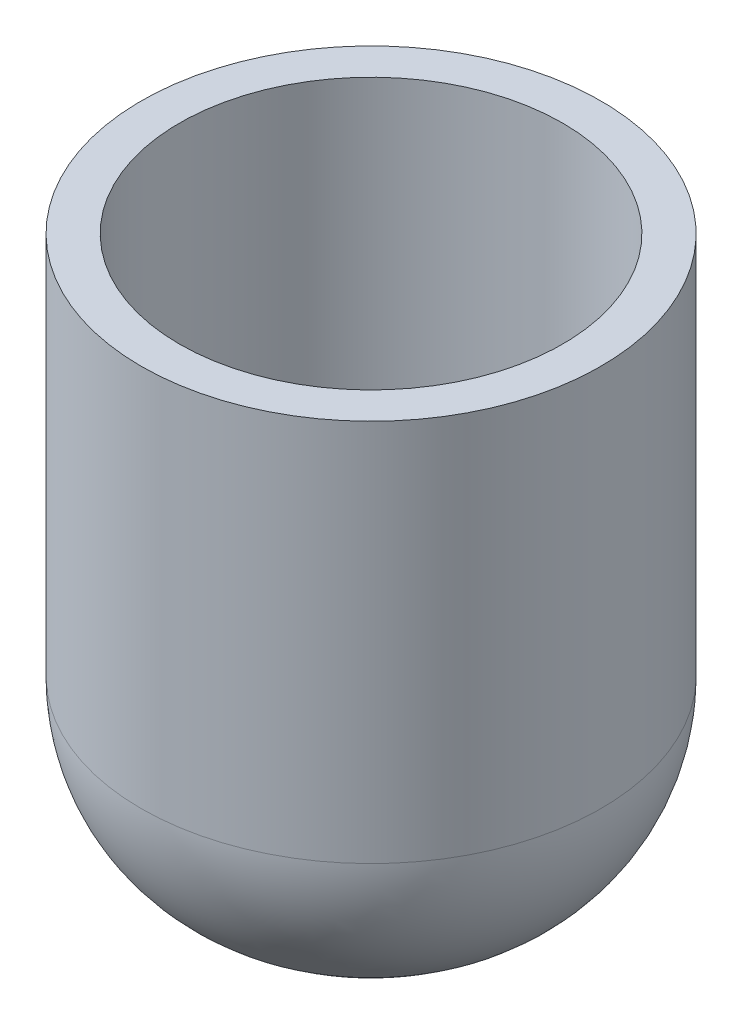
ISO-10303-21;
HEADER;
FILE_DESCRIPTION(('STEP AP214'),'2;1');
FILE_NAME('part.step','',(''),(''),'','','');
FILE_SCHEMA(('AUTOMOTIVE_DESIGN { 1 0 10303 214 1 1 1 1 }'));
ENDSEC;
DATA;
#1=APPLICATION_CONTEXT('core data for automotive mechanical design processes');
#2=APPLICATION_PROTOCOL_DEFINITION('international standard','automotive_design',2000,#1);
#3=PRODUCT_CONTEXT('',#1,'mechanical');
#4=PRODUCT('Part','Part','',(#3));
#5=PRODUCT_RELATED_PRODUCT_CATEGORY('part','',(#4));
#6=PRODUCT_DEFINITION_FORMATION('','',#4);
#7=PRODUCT_DEFINITION_CONTEXT('part definition',#1,'design');
#8=PRODUCT_DEFINITION('design','',#6,#7);
#9=PRODUCT_DEFINITION_SHAPE('','',#8);
#10=(LENGTH_UNIT() NAMED_UNIT(*) SI_UNIT(.MILLI.,.METRE.));
#11=(NAMED_UNIT(*) PLANE_ANGLE_UNIT() SI_UNIT($,.RADIAN.));
#12=(NAMED_UNIT(*) SI_UNIT($,.STERADIAN.) SOLID_ANGLE_UNIT());
#13=UNCERTAINTY_MEASURE_WITH_UNIT(LENGTH_MEASURE(1.E-05),#10,'distance_accuracy_value','');
#14=(GEOMETRIC_REPRESENTATION_CONTEXT(3) GLOBAL_UNCERTAINTY_ASSIGNED_CONTEXT((#13)) GLOBAL_UNIT_ASSIGNED_CONTEXT((#10,
#11,#12)) REPRESENTATION_CONTEXT('',''));
#15=CARTESIAN_POINT('',(0.,0.,0.));
#16=DIRECTION('',(0.,0.,1.));
#17=DIRECTION('',(1.,0.,0.));
#18=AXIS2_PLACEMENT_3D('',#15,#16,#17);
#19=CARTESIAN_POINT('',(0.,-19.05,0.));
#20=DIRECTION('',(0.,1.,0.));
#21=DIRECTION('',(0.,0.,1.));
#22=AXIS2_PLACEMENT_3D('',#19,#20,#21);
#23=CYLINDRICAL_SURFACE('',#22,7.62);
#24=CARTESIAN_POINT('',(0.,-12.7,0.));
#25=DIRECTION('',(0.,1.,0.));
#26=DIRECTION('',(0.,0.,1.));
#27=AXIS2_PLACEMENT_3D('',#24,#25,#26);
#28=CIRCLE('',#27,7.62);
#29=CARTESIAN_POINT('',(0.,-12.7,7.62));
#30=VERTEX_POINT('',#29);
#31=EDGE_CURVE('E40',#30,#30,#28,.T.);
#32=CARTESIAN_POINT('',(0.,0.,0.));
#33=DIRECTION('',(0.,1.,0.));
#34=DIRECTION('',(0.,0.,1.));
#35=AXIS2_PLACEMENT_3D('',#32,#33,#34);
#36=CIRCLE('',#35,7.62);
#37=CARTESIAN_POINT('',(0.,0.,7.62));
#38=VERTEX_POINT('',#37);
#39=EDGE_CURVE('E44',#38,#38,#36,.T.);
#40=CARTESIAN_POINT('',(0.,-12.7,7.62));
#41=CARTESIAN_POINT('',(0.,-12.5677083333333,7.62));
#42=CARTESIAN_POINT('',(0.,-12.4354166666667,7.62));
#43=CARTESIAN_POINT('',(0.,-12.1708333333333,7.62));
#44=CARTESIAN_POINT('',(0.,-12.0385416666667,7.62));
#45=CARTESIAN_POINT('',(0.,-11.7739583333333,7.62));
#46=CARTESIAN_POINT('',(0.,-11.6416666666667,7.62));
#47=CARTESIAN_POINT('',(0.,-11.3770833333333,7.62));
#48=CARTESIAN_POINT('',(0.,-11.2447916666667,7.62));
#49=CARTESIAN_POINT('',(0.,-10.9802083333333,7.62));
#50=CARTESIAN_POINT('',(0.,-10.8479166666667,7.62));
#51=CARTESIAN_POINT('',(0.,-10.5833333333333,7.62));
#52=CARTESIAN_POINT('',(0.,-10.4510416666667,7.62));
#53=CARTESIAN_POINT('',(0.,-10.1864583333333,7.62));
#54=CARTESIAN_POINT('',(0.,-10.0541666666667,7.62));
#55=CARTESIAN_POINT('',(0.,-9.78958333333333,7.62));
#56=CARTESIAN_POINT('',(0.,-9.65729166666666,7.62));
#57=CARTESIAN_POINT('',(0.,-9.39270833333333,7.62));
#58=CARTESIAN_POINT('',(0.,-9.26041666666666,7.62));
#59=CARTESIAN_POINT('',(0.,-8.99583333333333,7.62));
#60=CARTESIAN_POINT('',(0.,-8.86354166666666,7.62));
#61=CARTESIAN_POINT('',(0.,-8.59895833333333,7.62));
#62=CARTESIAN_POINT('',(0.,-8.46666666666666,7.62));
#63=CARTESIAN_POINT('',(0.,-8.20208333333333,7.62));
#64=CARTESIAN_POINT('',(0.,-8.06979166666666,7.62));
#65=CARTESIAN_POINT('',(0.,-7.80520833333333,7.62));
#66=CARTESIAN_POINT('',(0.,-7.67291666666666,7.62));
#67=CARTESIAN_POINT('',(0.,-7.40833333333333,7.62));
#68=CARTESIAN_POINT('',(0.,-7.27604166666666,7.62));
#69=CARTESIAN_POINT('',(0.,-7.01145833333333,7.62));
#70=CARTESIAN_POINT('',(0.,-6.87916666666666,7.62));
#71=CARTESIAN_POINT('',(0.,-6.61458333333333,7.62));
#72=CARTESIAN_POINT('',(0.,-6.48229166666666,7.62));
#73=CARTESIAN_POINT('',(0.,-6.21770833333333,7.62));
#74=CARTESIAN_POINT('',(0.,-6.08541666666666,7.62));
#75=CARTESIAN_POINT('',(0.,-5.82083333333333,7.62));
#76=CARTESIAN_POINT('',(0.,-5.68854166666666,7.62));
#77=CARTESIAN_POINT('',(0.,-5.42395833333333,7.62));
#78=CARTESIAN_POINT('',(0.,-5.29166666666666,7.62));
#79=CARTESIAN_POINT('',(0.,-5.02708333333333,7.62));
#80=CARTESIAN_POINT('',(0.,-4.89479166666666,7.62));
#81=CARTESIAN_POINT('',(0.,-4.63020833333333,7.62));
#82=CARTESIAN_POINT('',(0.,-4.49791666666666,7.62));
#83=CARTESIAN_POINT('',(0.,-4.23333333333333,7.62));
#84=CARTESIAN_POINT('',(0.,-4.10104166666666,7.62));
#85=CARTESIAN_POINT('',(0.,-3.83645833333333,7.62));
#86=CARTESIAN_POINT('',(0.,-3.70416666666666,7.62));
#87=CARTESIAN_POINT('',(0.,-3.43958333333333,7.62));
#88=CARTESIAN_POINT('',(0.,-3.30729166666666,7.62));
#89=CARTESIAN_POINT('',(0.,-3.04270833333333,7.62));
#90=CARTESIAN_POINT('',(0.,-2.91041666666667,7.62));
#91=CARTESIAN_POINT('',(0.,-2.64583333333333,7.62));
#92=CARTESIAN_POINT('',(0.,-2.51354166666667,7.62));
#93=CARTESIAN_POINT('',(0.,-2.24895833333333,7.62));
#94=CARTESIAN_POINT('',(0.,-2.11666666666667,7.62));
#95=CARTESIAN_POINT('',(0.,-1.85208333333333,7.62));
#96=CARTESIAN_POINT('',(0.,-1.71979166666667,7.62));
#97=CARTESIAN_POINT('',(0.,-1.45520833333333,7.62));
#98=CARTESIAN_POINT('',(0.,-1.32291666666667,7.62));
#99=CARTESIAN_POINT('',(0.,-1.05833333333333,7.62));
#100=CARTESIAN_POINT('',(0.,-0.926041666666666,7.62));
#101=CARTESIAN_POINT('',(0.,-0.661458333333332,7.62));
#102=CARTESIAN_POINT('',(0.,-0.529166666666665,7.62));
#103=CARTESIAN_POINT('',(0.,-0.264583333333332,7.62));
#104=CARTESIAN_POINT('',(0.,-0.132291666666666,7.62));
#105=CARTESIAN_POINT('',(0.,0.,7.62));
#106=B_SPLINE_CURVE_WITH_KNOTS('',3,(#40,#41,#42,#43,#44,#45,#46,#47,#48,#49,#50,#51,#52,#53,
#54,#55,#56,#57,#58,#59,#60,#61,#62,#63,#64,#65,#66,#67,#68,#69,#70,#71,#72,#73,#74,#75,#76,#77,
#78,#79,#80,#81,#82,#83,#84,#85,#86,#87,#88,#89,#90,#91,#92,#93,#94,#95,#96,#97,#98,#99,#100,
#101,#102,#103,#104,#105),.UNSPECIFIED.,.F.,.F.,(4,2,2,2,2,2,2,2,2,2,2,2,2,2,2,2,2,2,2,2,2,2,2,
2,2,2,2,2,2,2,2,2,4),(0.,0.396874999999998,0.793749999999999,1.190625,1.5875,1.984375,2.38125,
2.778125,3.175,3.571875,3.96875,4.365625,4.7625,5.159375,5.55625,5.953125,6.35,6.746875,7.14375,
7.540625,7.93749999999999,8.334375,8.73125,9.128125,9.525,9.92187499999999,10.31875,10.715625,
11.1125,11.509375,11.90625,12.303125,12.7),.UNSPECIFIED.);
#107=EDGE_CURVE('BSEAM33',#30,#38,#106,.T.);
#108=ORIENTED_EDGE('',*,*,#31,.T.);
#109=ORIENTED_EDGE('',*,*,#39,.F.);
#110=ORIENTED_EDGE('',*,*,#107,.T.);
#111=ORIENTED_EDGE('',*,*,#107,.F.);
#112=EDGE_LOOP('',(#108,#110,#109,#111));
#113=FACE_BOUND('',#112,.T.);
#114=ADVANCED_FACE('F33',(#113),#23,.T.);
#115=CARTESIAN_POINT('',(0.,-19.05,0.));
#116=DIRECTION('',(0.,1.,0.));
#117=DIRECTION('',(0.,0.,1.));
#118=AXIS2_PLACEMENT_3D('',#115,#116,#117);
#119=PLANE('',#118);
#120=CARTESIAN_POINT('',(0.,-19.05,0.));
#121=DIRECTION('',(0.,1.,0.));
#122=DIRECTION('',(0.,0.,1.));
#123=AXIS2_PLACEMENT_3D('',#120,#121,#122);
#124=CIRCLE('',#123,1.27);
#125=CARTESIAN_POINT('',(0.,-19.05,1.27));
#126=VERTEX_POINT('',#125);
#127=EDGE_CURVE('E10',#126,#126,#124,.F.);
#128=ORIENTED_EDGE('',*,*,#127,.T.);
#129=EDGE_LOOP('',(#128));
#130=FACE_BOUND('',#129,.T.);
#131=ADVANCED_FACE('F72',(#130),#119,.F.);
#132=CARTESIAN_POINT('',(0.,0.,0.));
#133=DIRECTION('',(0.,1.,0.));
#134=DIRECTION('',(0.,0.,1.));
#135=AXIS2_PLACEMENT_3D('',#132,#133,#134);
#136=PLANE('',#135);
#137=CARTESIAN_POINT('',(0.,0.,0.));
#138=DIRECTION('',(0.,1.,0.));
#139=DIRECTION('',(0.,0.,1.));
#140=AXIS2_PLACEMENT_3D('',#137,#138,#139);
#141=CIRCLE('',#140,6.35);
#142=CARTESIAN_POINT('',(0.,0.,6.35));
#143=VERTEX_POINT('',#142);
#144=EDGE_CURVE('E51',#143,#143,#141,.T.);
#145=ORIENTED_EDGE('',*,*,#144,.F.);
#146=EDGE_LOOP('',(#145));
#147=FACE_BOUND('',#146,.T.);
#148=ORIENTED_EDGE('',*,*,#39,.T.);
#149=EDGE_LOOP('',(#148));
#150=FACE_BOUND('',#149,.T.);
#151=ADVANCED_FACE('F69',(#147,#150),#136,.T.);
#152=CARTESIAN_POINT('',(0.,-12.7,0.));
#153=DIRECTION('',(0.,1.,0.));
#154=DIRECTION('',(0.,0.,1.));
#155=AXIS2_PLACEMENT_3D('',#152,#153,#154);
#156=DEGENERATE_TOROIDAL_SURFACE('',#155,1.27,6.35,.T.);
#157=ORIENTED_EDGE('',*,*,#127,.F.);
#158=EDGE_LOOP('',(#157));
#159=FACE_BOUND('',#158,.T.);
#160=ORIENTED_EDGE('',*,*,#31,.F.);
#161=EDGE_LOOP('',(#160));
#162=FACE_BOUND('',#161,.T.);
#163=ADVANCED_FACE('F35',(#159,#162),#156,.T.);
#164=CARTESIAN_POINT('',(0.,-19.05,0.));
#165=DIRECTION('',(0.,1.,0.));
#166=DIRECTION('',(0.,0.,1.));
#167=AXIS2_PLACEMENT_3D('',#164,#165,#166);
#168=CYLINDRICAL_SURFACE('',#167,6.35);
#169=CARTESIAN_POINT('',(0.,-12.7,0.));
#170=DIRECTION('',(0.,1.,0.));
#171=DIRECTION('',(0.,0.,1.));
#172=AXIS2_PLACEMENT_3D('',#169,#170,#171);
#173=CIRCLE('',#172,6.35);
#174=CARTESIAN_POINT('',(0.,-12.7,6.35));
#175=VERTEX_POINT('',#174);
#176=EDGE_CURVE('E54',#175,#175,#173,.T.);
#177=CARTESIAN_POINT('',(0.,-12.7,6.35));
#178=CARTESIAN_POINT('',(0.,-12.5677083333333,6.35));
#179=CARTESIAN_POINT('',(0.,-12.4354166666667,6.35));
#180=CARTESIAN_POINT('',(0.,-12.1708333333333,6.35));
#181=CARTESIAN_POINT('',(0.,-12.0385416666667,6.35));
#182=CARTESIAN_POINT('',(0.,-11.7739583333333,6.35));
#183=CARTESIAN_POINT('',(0.,-11.6416666666667,6.35));
#184=CARTESIAN_POINT('',(0.,-11.3770833333333,6.35));
#185=CARTESIAN_POINT('',(0.,-11.2447916666667,6.35));
#186=CARTESIAN_POINT('',(0.,-10.9802083333333,6.35));
#187=CARTESIAN_POINT('',(0.,-10.8479166666667,6.35));
#188=CARTESIAN_POINT('',(0.,-10.5833333333333,6.35));
#189=CARTESIAN_POINT('',(0.,-10.4510416666667,6.35));
#190=CARTESIAN_POINT('',(0.,-10.1864583333333,6.35));
#191=CARTESIAN_POINT('',(0.,-10.0541666666667,6.35));
#192=CARTESIAN_POINT('',(0.,-9.78958333333333,6.35));
#193=CARTESIAN_POINT('',(0.,-9.65729166666666,6.35));
#194=CARTESIAN_POINT('',(0.,-9.39270833333333,6.35));
#195=CARTESIAN_POINT('',(0.,-9.26041666666666,6.35));
#196=CARTESIAN_POINT('',(0.,-8.99583333333333,6.35));
#197=CARTESIAN_POINT('',(0.,-8.86354166666666,6.35));
#198=CARTESIAN_POINT('',(0.,-8.59895833333333,6.35));
#199=CARTESIAN_POINT('',(0.,-8.46666666666666,6.35));
#200=CARTESIAN_POINT('',(0.,-8.20208333333333,6.35));
#201=CARTESIAN_POINT('',(0.,-8.06979166666666,6.35));
#202=CARTESIAN_POINT('',(0.,-7.80520833333333,6.35));
#203=CARTESIAN_POINT('',(0.,-7.67291666666666,6.35));
#204=CARTESIAN_POINT('',(0.,-7.40833333333333,6.35));
#205=CARTESIAN_POINT('',(0.,-7.27604166666666,6.35));
#206=CARTESIAN_POINT('',(0.,-7.01145833333333,6.35));
#207=CARTESIAN_POINT('',(0.,-6.87916666666666,6.35));
#208=CARTESIAN_POINT('',(0.,-6.61458333333333,6.35));
#209=CARTESIAN_POINT('',(0.,-6.48229166666666,6.35));
#210=CARTESIAN_POINT('',(0.,-6.21770833333333,6.35));
#211=CARTESIAN_POINT('',(0.,-6.08541666666666,6.35));
#212=CARTESIAN_POINT('',(0.,-5.82083333333333,6.35));
#213=CARTESIAN_POINT('',(0.,-5.68854166666666,6.35));
#214=CARTESIAN_POINT('',(0.,-5.42395833333333,6.35));
#215=CARTESIAN_POINT('',(0.,-5.29166666666666,6.35));
#216=CARTESIAN_POINT('',(0.,-5.02708333333333,6.35));
#217=CARTESIAN_POINT('',(0.,-4.89479166666666,6.35));
#218=CARTESIAN_POINT('',(0.,-4.63020833333333,6.35));
#219=CARTESIAN_POINT('',(0.,-4.49791666666667,6.35));
#220=CARTESIAN_POINT('',(0.,-4.23333333333333,6.35));
#221=CARTESIAN_POINT('',(0.,-4.10104166666667,6.35));
#222=CARTESIAN_POINT('',(0.,-3.83645833333333,6.35));
#223=CARTESIAN_POINT('',(0.,-3.70416666666666,6.35));
#224=CARTESIAN_POINT('',(0.,-3.43958333333333,6.35));
#225=CARTESIAN_POINT('',(0.,-3.30729166666666,6.35));
#226=CARTESIAN_POINT('',(0.,-3.04270833333333,6.35));
#227=CARTESIAN_POINT('',(0.,-2.91041666666667,6.35));
#228=CARTESIAN_POINT('',(0.,-2.64583333333333,6.35));
#229=CARTESIAN_POINT('',(0.,-2.51354166666667,6.35));
#230=CARTESIAN_POINT('',(0.,-2.24895833333333,6.35));
#231=CARTESIAN_POINT('',(0.,-2.11666666666667,6.35));
#232=CARTESIAN_POINT('',(0.,-1.85208333333333,6.35));
#233=CARTESIAN_POINT('',(0.,-1.71979166666667,6.35));
#234=CARTESIAN_POINT('',(0.,-1.45520833333333,6.35));
#235=CARTESIAN_POINT('',(0.,-1.32291666666667,6.35));
#236=CARTESIAN_POINT('',(0.,-1.05833333333333,6.35));
#237=CARTESIAN_POINT('',(0.,-0.926041666666666,6.35));
#238=CARTESIAN_POINT('',(0.,-0.661458333333332,6.35));
#239=CARTESIAN_POINT('',(0.,-0.529166666666665,6.35));
#240=CARTESIAN_POINT('',(0.,-0.264583333333332,6.35));
#241=CARTESIAN_POINT('',(0.,-0.132291666666666,6.35));
#242=CARTESIAN_POINT('',(0.,0.,6.35));
#243=B_SPLINE_CURVE_WITH_KNOTS('',3,(#177,#178,#179,#180,#181,#182,#183,#184,#185,#186,#187,
#188,#189,#190,#191,#192,#193,#194,#195,#196,#197,#198,#199,#200,#201,#202,#203,#204,#205,#206,
#207,#208,#209,#210,#211,#212,#213,#214,#215,#216,#217,#218,#219,#220,#221,#222,#223,#224,#225,
#226,#227,#228,#229,#230,#231,#232,#233,#234,#235,#236,#237,#238,#239,#240,#241,#242),
.UNSPECIFIED.,.F.,.F.,(4,2,2,2,2,2,2,2,2,2,2,2,2,2,2,2,2,2,2,2,2,2,2,2,2,2,2,2,2,2,2,2,4),(0.,
0.396875000000001,0.793750000000001,1.190625,1.5875,1.984375,2.38125,2.778125,3.175,3.571875,
3.96875,4.365625,4.7625,5.159375,5.55625,5.953125,6.35,6.746875,7.14375,7.540625,7.9375,
8.334375,8.73125,9.128125,9.525,9.921875,10.31875,10.715625,11.1125,11.509375,11.90625,
12.303125,12.7),.UNSPECIFIED.);
#244=EDGE_CURVE('BSEAM62',#175,#143,#243,.T.);
#245=ORIENTED_EDGE('',*,*,#176,.F.);
#246=ORIENTED_EDGE('',*,*,#144,.T.);
#247=ORIENTED_EDGE('',*,*,#244,.T.);
#248=ORIENTED_EDGE('',*,*,#244,.F.);
#249=EDGE_LOOP('',(#245,#247,#246,#248));
#250=FACE_BOUND('',#249,.T.);
#251=ADVANCED_FACE('F62',(#250),#168,.F.);
#252=CARTESIAN_POINT('',(0.,-17.78,0.));
#253=DIRECTION('',(0.,1.,0.));
#254=DIRECTION('',(0.,0.,1.));
#255=AXIS2_PLACEMENT_3D('',#252,#253,#254);
#256=PLANE('',#255);
#257=CARTESIAN_POINT('',(0.,-17.78,0.));
#258=DIRECTION('',(0.,1.,0.));
#259=DIRECTION('',(0.,0.,1.));
#260=AXIS2_PLACEMENT_3D('',#257,#258,#259);
#261=CIRCLE('',#260,1.27);
#262=CARTESIAN_POINT('',(0.,-17.78,1.27));
#263=VERTEX_POINT('',#262);
#264=EDGE_CURVE('E48',#263,#263,#261,.F.);
#265=ORIENTED_EDGE('',*,*,#264,.F.);
#266=EDGE_LOOP('',(#265));
#267=FACE_BOUND('',#266,.T.);
#268=ADVANCED_FACE('F65',(#267),#256,.T.);
#269=CARTESIAN_POINT('',(0.,-12.7,0.));
#270=DIRECTION('',(0.,1.,0.));
#271=DIRECTION('',(0.,0.,1.));
#272=AXIS2_PLACEMENT_3D('',#269,#270,#271);
#273=DEGENERATE_TOROIDAL_SURFACE('',#272,1.27,5.08,.T.);
#274=ORIENTED_EDGE('',*,*,#264,.T.);
#275=EDGE_LOOP('',(#274));
#276=FACE_BOUND('',#275,.T.);
#277=ORIENTED_EDGE('',*,*,#176,.T.);
#278=EDGE_LOOP('',(#277));
#279=FACE_BOUND('',#278,.T.);
#280=ADVANCED_FACE('F60',(#276,#279),#273,.F.);
#281=CLOSED_SHELL('',(#114,#131,#151,#163,#251,#268,#280));
#282=MANIFOLD_SOLID_BREP('B2',#281);
#283=ADVANCED_BREP_SHAPE_REPRESENTATION('',(#18,#282),#14);
#284=SHAPE_DEFINITION_REPRESENTATION(#9,#283);
ENDSEC;
END-ISO-10303-21;
